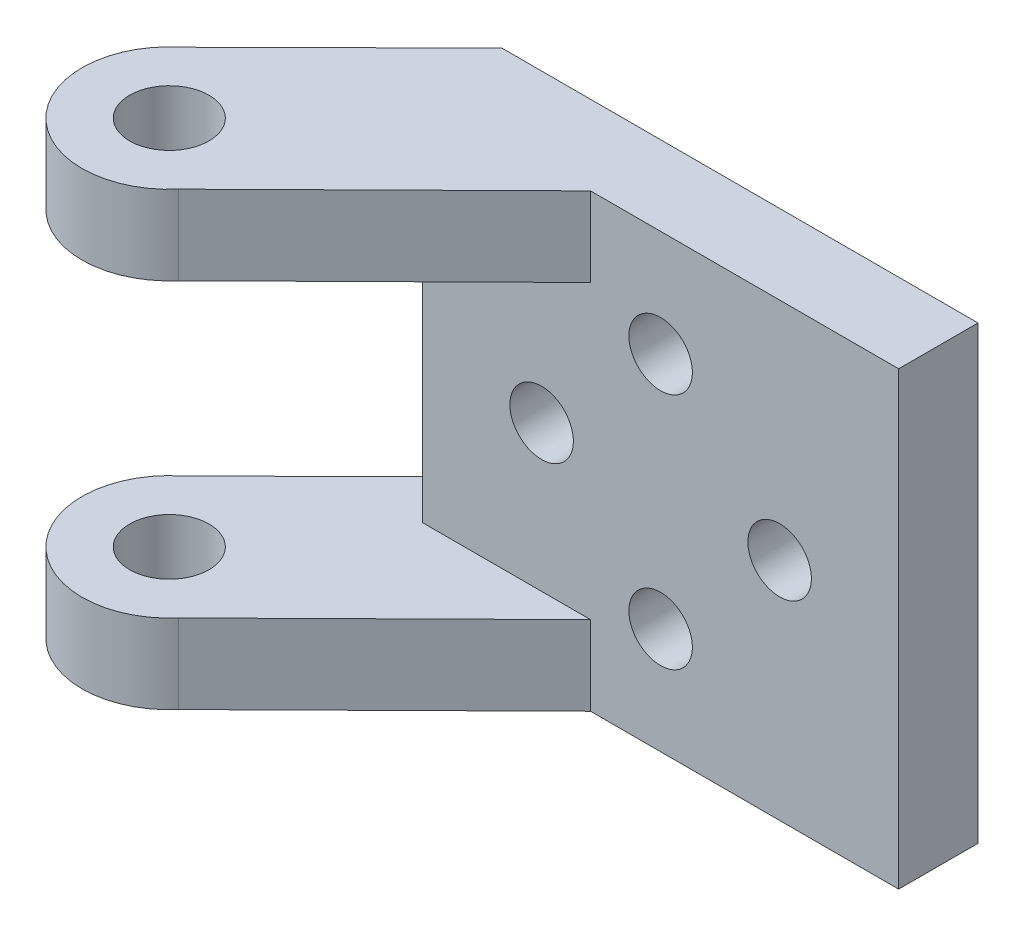
ISO-10303-21;
HEADER;
FILE_DESCRIPTION(('STEP AP214'),'2;1');
FILE_NAME('part.step','',(''),(''),'','','');
FILE_SCHEMA(('AUTOMOTIVE_DESIGN { 1 0 10303 214 1 1 1 1 }'));
ENDSEC;
DATA;
#1=APPLICATION_CONTEXT('core data for automotive mechanical design processes');
#2=APPLICATION_PROTOCOL_DEFINITION('international standard','automotive_design',2000,#1);
#3=PRODUCT_CONTEXT('',#1,'mechanical');
#4=PRODUCT('Part','Part','',(#3));
#5=PRODUCT_RELATED_PRODUCT_CATEGORY('part','',(#4));
#6=PRODUCT_DEFINITION_FORMATION('','',#4);
#7=PRODUCT_DEFINITION_CONTEXT('part definition',#1,'design');
#8=PRODUCT_DEFINITION('design','',#6,#7);
#9=PRODUCT_DEFINITION_SHAPE('','',#8);
#10=(LENGTH_UNIT() NAMED_UNIT(*) SI_UNIT(.MILLI.,.METRE.));
#11=(NAMED_UNIT(*) PLANE_ANGLE_UNIT() SI_UNIT($,.RADIAN.));
#12=(NAMED_UNIT(*) SI_UNIT($,.STERADIAN.) SOLID_ANGLE_UNIT());
#13=UNCERTAINTY_MEASURE_WITH_UNIT(LENGTH_MEASURE(1.E-05),#10,'distance_accuracy_value','');
#14=(GEOMETRIC_REPRESENTATION_CONTEXT(3) GLOBAL_UNCERTAINTY_ASSIGNED_CONTEXT((#13)) GLOBAL_UNIT_ASSIGNED_CONTEXT((#10,
#11,#12)) REPRESENTATION_CONTEXT('',''));
#15=CARTESIAN_POINT('',(0.,0.,0.));
#16=DIRECTION('',(0.,0.,1.));
#17=DIRECTION('',(1.,0.,0.));
#18=AXIS2_PLACEMENT_3D('',#15,#16,#17);
#19=CARTESIAN_POINT('',(-9.95038998939699,0.,-10.0555162784989));
#20=DIRECTION('',(-1.,0.,0.));
#21=DIRECTION('',(0.,-1.,0.));
#22=AXIS2_PLACEMENT_3D('',#19,#20,#21);
#23=PLANE('',#22);
#24=DIRECTION('',(0.,1.,0.));
#25=VECTOR('',#24,1.);
#26=CARTESIAN_POINT('',(-9.95038998939699,0.,-10.0555162784989));
#27=LINE('',#26,#25);
#28=CARTESIAN_POINT('',(-9.95038998939701,5.,-10.0555162784989));
#29=VERTEX_POINT('',#28);
#30=CARTESIAN_POINT('',(-9.950389989397,23.4,-10.0555162784989));
#31=VERTEX_POINT('',#30);
#32=EDGE_CURVE('E190',#29,#31,#27,.T.);
#33=ORIENTED_EDGE('',*,*,#32,.T.);
#34=DIRECTION('',(0.,0.,-1.));
#35=VECTOR('',#34,1.);
#36=CARTESIAN_POINT('',(-9.95038998939701,23.4,-10.0555162784989));
#37=LINE('',#36,#35);
#38=CARTESIAN_POINT('',(-9.950389989397,23.4,-15.0555162784989));
#39=VERTEX_POINT('',#38);
#40=EDGE_CURVE('E155',#31,#39,#37,.T.);
#41=ORIENTED_EDGE('',*,*,#40,.T.);
#42=DIRECTION('',(0.,1.,0.));
#43=VECTOR('',#42,1.);
#44=CARTESIAN_POINT('',(-9.95038998939699,0.,-15.0555162784989));
#45=LINE('',#44,#43);
#46=CARTESIAN_POINT('',(-9.950389989397,5.,-15.0555162784989));
#47=VERTEX_POINT('',#46);
#48=EDGE_CURVE('E212',#47,#39,#45,.T.);
#49=ORIENTED_EDGE('',*,*,#48,.F.);
#50=DIRECTION('',(0.,0.,-1.));
#51=VECTOR('',#50,1.);
#52=CARTESIAN_POINT('',(-9.950389989397,5.,-10.0555162784989));
#53=LINE('',#52,#51);
#54=EDGE_CURVE('E208',#29,#47,#53,.T.);
#55=ORIENTED_EDGE('',*,*,#54,.F.);
#56=EDGE_LOOP('',(#33,#41,#49,#55));
#57=FACE_BOUND('',#56,.T.);
#58=ADVANCED_FACE('F45',(#57),#23,.T.);
#59=CARTESIAN_POINT('',(-16.6118165220027,5.,-0.755516278498874));
#60=DIRECTION('',(0.,1.,0.));
#61=DIRECTION('',(0.,0.,1.));
#62=AXIS2_PLACEMENT_3D('',#59,#60,#61);
#63=PLANE('',#62);
#64=ORIENTED_EDGE('',*,*,#54,.T.);
#65=DIRECTION('',(-0.710498315696262,0.,0.703698901088225));
#66=VECTOR('',#65,1.);
#67=CARTESIAN_POINT('',(-9.950389989397,5.,-15.0555162784989));
#68=LINE('',#67,#66);
#69=CARTESIAN_POINT('',(-20.0724252886169,5.,-5.03034808389572));
#70=VERTEX_POINT('',#69);
#71=EDGE_CURVE('E246',#47,#70,#68,.T.);
#72=ORIENTED_EDGE('',*,*,#71,.T.);
#73=CARTESIAN_POINT('',(-16.6118165220027,5.,-0.755516278498874));
#74=DIRECTION('',(0.,1.,0.));
#75=DIRECTION('',(0.,0.,1.));
#76=AXIS2_PLACEMENT_3D('',#73,#74,#75);
#77=CIRCLE('',#76,5.5);
#78=CARTESIAN_POINT('',(-12.4365712653716,5.,2.8246131949951));
#79=VERTEX_POINT('',#78);
#80=EDGE_CURVE('E249',#70,#79,#77,.T.);
#81=ORIENTED_EDGE('',*,*,#80,.T.);
#82=DIRECTION('',(0.712249487664979,0.,-0.701926397367256));
#83=VECTOR('',#82,1.);
#84=CARTESIAN_POINT('',(-12.4365712653716,5.,2.8246131949951));
#85=LINE('',#84,#83);
#86=CARTESIAN_POINT('',(0.632983680792908,5.,-10.0555162784989));
#87=VERTEX_POINT('',#86);
#88=EDGE_CURVE('E253',#79,#87,#85,.T.);
#89=ORIENTED_EDGE('',*,*,#88,.T.);
#90=DIRECTION('',(1.,0.,0.));
#91=VECTOR('',#90,1.);
#92=CARTESIAN_POINT('',(0.,5.,-10.0555162784989));
#93=LINE('',#92,#91);
#94=EDGE_CURVE('E185',#29,#87,#93,.T.);
#95=ORIENTED_EDGE('',*,*,#94,.F.);
#96=EDGE_LOOP('',(#64,#72,#81,#89,#95));
#97=FACE_BOUND('',#96,.T.);
#98=CARTESIAN_POINT('',(-16.6118165220027,5.,-0.755516278498874));
#99=DIRECTION('',(0.,1.,0.));
#100=DIRECTION('',(0.,0.,1.));
#101=AXIS2_PLACEMENT_3D('',#98,#99,#100);
#102=CIRCLE('',#101,2.5);
#103=CARTESIAN_POINT('',(-16.6118165220027,5.,1.74448372150113));
#104=VERTEX_POINT('',#103);
#105=EDGE_CURVE('E238',#104,#104,#102,.T.);
#106=ORIENTED_EDGE('',*,*,#105,.F.);
#107=EDGE_LOOP('',(#106));
#108=FACE_BOUND('',#107,.T.);
#109=ADVANCED_FACE('F314',(#97,#108),#63,.T.);
#110=CARTESIAN_POINT('',(-16.6118165220027,0.,-0.755516278498874));
#111=DIRECTION('',(0.,1.,0.));
#112=DIRECTION('',(0.,0.,1.));
#113=AXIS2_PLACEMENT_3D('',#110,#111,#112);
#114=PLANE('',#113);
#115=DIRECTION('',(0.,0.,-1.));
#116=VECTOR('',#115,1.);
#117=CARTESIAN_POINT('',(20.049610010603,0.,-10.0555162784989));
#118=LINE('',#117,#116);
#119=CARTESIAN_POINT('',(20.049610010603,0.,-10.0555162784989));
#120=VERTEX_POINT('',#119);
#121=CARTESIAN_POINT('',(20.049610010603,0.,-15.0555162784989));
#122=VERTEX_POINT('',#121);
#123=EDGE_CURVE('E242',#120,#122,#118,.T.);
#124=ORIENTED_EDGE('',*,*,#123,.F.);
#125=DIRECTION('',(1.,0.,0.));
#126=VECTOR('',#125,1.);
#127=CARTESIAN_POINT('',(0.632983680792908,0.,-10.0555162784989));
#128=LINE('',#127,#126);
#129=CARTESIAN_POINT('',(0.632983680792908,0.,-10.0555162784989));
#130=VERTEX_POINT('',#129);
#131=EDGE_CURVE('E250',#130,#120,#128,.T.);
#132=ORIENTED_EDGE('',*,*,#131,.F.);
#133=DIRECTION('',(0.712249487664979,0.,-0.701926397367256));
#134=VECTOR('',#133,1.);
#135=CARTESIAN_POINT('',(-12.4365712653716,0.,2.8246131949951));
#136=LINE('',#135,#134);
#137=CARTESIAN_POINT('',(-12.4365712653716,0.,2.8246131949951));
#138=VERTEX_POINT('',#137);
#139=EDGE_CURVE('E269',#138,#130,#136,.T.);
#140=ORIENTED_EDGE('',*,*,#139,.F.);
#141=CARTESIAN_POINT('',(-16.6118165220027,0.,-0.755516278498874));
#142=DIRECTION('',(0.,1.,0.));
#143=DIRECTION('',(0.,0.,1.));
#144=AXIS2_PLACEMENT_3D('',#141,#142,#143);
#145=CIRCLE('',#144,5.5);
#146=CARTESIAN_POINT('',(-20.0724252886169,0.,-5.03034808389572));
#147=VERTEX_POINT('',#146);
#148=EDGE_CURVE('E266',#147,#138,#145,.T.);
#149=ORIENTED_EDGE('',*,*,#148,.F.);
#150=DIRECTION('',(-0.710498315696262,0.,0.703698901088225));
#151=VECTOR('',#150,1.);
#152=CARTESIAN_POINT('',(-9.950389989397,0.,-15.0555162784989));
#153=LINE('',#152,#151);
#154=CARTESIAN_POINT('',(-9.950389989397,0.,-15.0555162784989));
#155=VERTEX_POINT('',#154);
#156=EDGE_CURVE('E263',#155,#147,#153,.T.);
#157=ORIENTED_EDGE('',*,*,#156,.F.);
#158=DIRECTION('',(-1.,0.,0.));
#159=VECTOR('',#158,1.);
#160=CARTESIAN_POINT('',(20.049610010603,0.,-15.0555162784989));
#161=LINE('',#160,#159);
#162=EDGE_CURVE('E260',#122,#155,#161,.T.);
#163=ORIENTED_EDGE('',*,*,#162,.F.);
#164=EDGE_LOOP('',(#124,#132,#140,#149,#157,#163));
#165=FACE_BOUND('',#164,.T.);
#166=CARTESIAN_POINT('',(-16.6118165220027,0.,-0.755516278498874));
#167=DIRECTION('',(0.,1.,0.));
#168=DIRECTION('',(0.,0.,1.));
#169=AXIS2_PLACEMENT_3D('',#166,#167,#168);
#170=CIRCLE('',#169,2.5);
#171=CARTESIAN_POINT('',(-16.6118165220027,0.,1.74448372150113));
#172=VERTEX_POINT('',#171);
#173=EDGE_CURVE('E235',#172,#172,#170,.T.);
#174=ORIENTED_EDGE('',*,*,#173,.T.);
#175=EDGE_LOOP('',(#174));
#176=FACE_BOUND('',#175,.T.);
#177=ADVANCED_FACE('F301',(#165,#176),#114,.F.);
#178=CARTESIAN_POINT('',(20.049610010603,5.,-10.0555162784989));
#179=DIRECTION('',(-1.,0.,0.));
#180=DIRECTION('',(0.,0.,1.));
#181=AXIS2_PLACEMENT_3D('',#178,#179,#180);
#182=PLANE('',#181);
#183=ORIENTED_EDGE('',*,*,#123,.T.);
#184=DIRECTION('',(0.,-1.,0.));
#185=VECTOR('',#184,1.);
#186=CARTESIAN_POINT('',(20.049610010603,5.,-15.0555162784989));
#187=LINE('',#186,#185);
#188=CARTESIAN_POINT('',(20.049610010603,28.4,-15.0555162784989));
#189=VERTEX_POINT('',#188);
#190=EDGE_CURVE('E11',#189,#122,#187,.T.);
#191=ORIENTED_EDGE('',*,*,#190,.F.);
#192=DIRECTION('',(0.,0.,-1.));
#193=VECTOR('',#192,1.);
#194=CARTESIAN_POINT('',(20.049610010603,28.4,-10.0555162784989));
#195=LINE('',#194,#193);
#196=CARTESIAN_POINT('',(20.049610010603,28.4,-10.0555162784989));
#197=VERTEX_POINT('',#196);
#198=EDGE_CURVE('E231',#197,#189,#195,.T.);
#199=ORIENTED_EDGE('',*,*,#198,.F.);
#200=DIRECTION('',(0.,-1.,0.));
#201=VECTOR('',#200,1.);
#202=CARTESIAN_POINT('',(20.049610010603,5.,-10.0555162784989));
#203=LINE('',#202,#201);
#204=EDGE_CURVE('E256',#197,#120,#203,.T.);
#205=ORIENTED_EDGE('',*,*,#204,.T.);
#206=EDGE_LOOP('',(#183,#191,#199,#205));
#207=FACE_BOUND('',#206,.T.);
#208=ADVANCED_FACE('F47',(#207),#182,.F.);
#209=CARTESIAN_POINT('',(20.049610010603,5.,-15.0555162784989));
#210=DIRECTION('',(0.,0.,1.));
#211=DIRECTION('',(1.,0.,0.));
#212=AXIS2_PLACEMENT_3D('',#209,#210,#211);
#213=PLANE('',#212);
#214=CARTESIAN_POINT('',(5.04961001060293,6.7,-15.0555162784989));
#215=DIRECTION('',(0.,0.,-1.));
#216=DIRECTION('',(-1.,0.,0.));
#217=AXIS2_PLACEMENT_3D('',#214,#215,#216);
#218=CIRCLE('',#217,2.00000000000001);
#219=CARTESIAN_POINT('',(3.04961001060292,6.7,-15.0555162784989));
#220=VERTEX_POINT('',#219);
#221=EDGE_CURVE('E176',#220,#220,#218,.T.);
#222=ORIENTED_EDGE('',*,*,#221,.F.);
#223=EDGE_LOOP('',(#222));
#224=FACE_BOUND('',#223,.T.);
#225=ORIENTED_EDGE('',*,*,#162,.T.);
#226=DIRECTION('',(0.,-1.,0.));
#227=VECTOR('',#226,1.);
#228=CARTESIAN_POINT('',(-9.950389989397,5.,-15.0555162784989));
#229=LINE('',#228,#227);
#230=EDGE_CURVE('E54',#47,#155,#229,.T.);
#231=ORIENTED_EDGE('',*,*,#230,.F.);
#232=ORIENTED_EDGE('',*,*,#48,.T.);
#233=DIRECTION('',(0.,1.,0.));
#234=VECTOR('',#233,1.);
#235=CARTESIAN_POINT('',(-9.95038998939701,23.4,-15.0555162784989));
#236=LINE('',#235,#234);
#237=CARTESIAN_POINT('',(-9.95038998939701,28.4,-15.0555162784989));
#238=VERTEX_POINT('',#237);
#239=EDGE_CURVE('E140',#39,#238,#236,.T.);
#240=ORIENTED_EDGE('',*,*,#239,.T.);
#241=DIRECTION('',(1.,0.,0.));
#242=VECTOR('',#241,1.);
#243=CARTESIAN_POINT('',(0.,28.4,-15.0555162784989));
#244=LINE('',#243,#242);
#245=EDGE_CURVE('E216',#238,#189,#244,.T.);
#246=ORIENTED_EDGE('',*,*,#245,.T.);
#247=ORIENTED_EDGE('',*,*,#190,.T.);
#248=EDGE_LOOP('',(#225,#231,#232,#240,#246,#247));
#249=FACE_BOUND('',#248,.T.);
#250=CARTESIAN_POINT('',(5.04961001060303,21.7,-15.0555162784989));
#251=DIRECTION('',(0.,0.,-1.));
#252=DIRECTION('',(-1.,0.,0.));
#253=AXIS2_PLACEMENT_3D('',#250,#251,#252);
#254=CIRCLE('',#253,2.);
#255=CARTESIAN_POINT('',(3.04961001060303,21.7,-15.0555162784989));
#256=VERTEX_POINT('',#255);
#257=EDGE_CURVE('E220',#256,#256,#254,.T.);
#258=ORIENTED_EDGE('',*,*,#257,.F.);
#259=EDGE_LOOP('',(#258));
#260=FACE_BOUND('',#259,.T.);
#261=CARTESIAN_POINT('',(12.549610010603,14.1999999999999,-15.0555162784989));
#262=DIRECTION('',(0.,0.,-1.));
#263=DIRECTION('',(-1.,0.,0.));
#264=AXIS2_PLACEMENT_3D('',#261,#262,#263);
#265=CIRCLE('',#264,2.00000000000001);
#266=CARTESIAN_POINT('',(10.549610010603,14.1999999999999,-15.0555162784989));
#267=VERTEX_POINT('',#266);
#268=EDGE_CURVE('E224',#267,#267,#265,.T.);
#269=ORIENTED_EDGE('',*,*,#268,.F.);
#270=EDGE_LOOP('',(#269));
#271=FACE_BOUND('',#270,.T.);
#272=CARTESIAN_POINT('',(-2.450389989397,14.2,-15.0555162784989));
#273=DIRECTION('',(0.,0.,-1.));
#274=DIRECTION('',(-1.,0.,0.));
#275=AXIS2_PLACEMENT_3D('',#272,#273,#274);
#276=CIRCLE('',#275,2.);
#277=CARTESIAN_POINT('',(-4.450389989397,14.2,-15.0555162784989));
#278=VERTEX_POINT('',#277);
#279=EDGE_CURVE('E186',#278,#278,#276,.T.);
#280=ORIENTED_EDGE('',*,*,#279,.F.);
#281=EDGE_LOOP('',(#280));
#282=FACE_BOUND('',#281,.T.);
#283=ADVANCED_FACE('F374',(#224,#249,#260,#271,#282),#213,.F.);
#284=CARTESIAN_POINT('',(-9.950389989397,5.,-15.0555162784989));
#285=DIRECTION('',(0.703698901088225,0.,0.710498315696262));
#286=DIRECTION('',(0.710498315696262,0.,-0.703698901088225));
#287=AXIS2_PLACEMENT_3D('',#284,#285,#286);
#288=PLANE('',#287);
#289=ORIENTED_EDGE('',*,*,#156,.T.);
#290=DIRECTION('',(0.,-1.,0.));
#291=VECTOR('',#290,1.);
#292=CARTESIAN_POINT('',(-20.0724252886169,5.,-5.03034808389572));
#293=LINE('',#292,#291);
#294=EDGE_CURVE('E285',#70,#147,#293,.T.);
#295=ORIENTED_EDGE('',*,*,#294,.F.);
#296=ORIENTED_EDGE('',*,*,#71,.F.);
#297=ORIENTED_EDGE('',*,*,#230,.T.);
#298=EDGE_LOOP('',(#289,#295,#296,#297));
#299=FACE_BOUND('',#298,.T.);
#300=ADVANCED_FACE('F294',(#299),#288,.F.);
#301=CARTESIAN_POINT('',(-16.6118165220027,5.,-0.755516278498874));
#302=DIRECTION('',(0.,-1.,0.));
#303=DIRECTION('',(0.,0.,-1.));
#304=AXIS2_PLACEMENT_3D('',#301,#302,#303);
#305=CYLINDRICAL_SURFACE('',#304,5.5);
#306=ORIENTED_EDGE('',*,*,#148,.T.);
#307=DIRECTION('',(0.,-1.,0.));
#308=VECTOR('',#307,1.);
#309=CARTESIAN_POINT('',(-12.4365712653716,5.,2.8246131949951));
#310=LINE('',#309,#308);
#311=EDGE_CURVE('E281',#79,#138,#310,.T.);
#312=ORIENTED_EDGE('',*,*,#311,.F.);
#313=ORIENTED_EDGE('',*,*,#80,.F.);
#314=ORIENTED_EDGE('',*,*,#294,.T.);
#315=EDGE_LOOP('',(#306,#312,#313,#314));
#316=FACE_BOUND('',#315,.T.);
#317=ADVANCED_FACE('F307',(#316),#305,.T.);
#318=CARTESIAN_POINT('',(-12.4365712653716,5.,2.8246131949951));
#319=DIRECTION('',(-0.701926397367256,0.,-0.712249487664979));
#320=DIRECTION('',(-0.712249487664979,0.,0.701926397367256));
#321=AXIS2_PLACEMENT_3D('',#318,#319,#320);
#322=PLANE('',#321);
#323=ORIENTED_EDGE('',*,*,#139,.T.);
#324=DIRECTION('',(0.,-1.,0.));
#325=VECTOR('',#324,1.);
#326=CARTESIAN_POINT('',(0.632983680792908,5.,-10.0555162784989));
#327=LINE('',#326,#325);
#328=EDGE_CURVE('E277',#87,#130,#327,.T.);
#329=ORIENTED_EDGE('',*,*,#328,.F.);
#330=ORIENTED_EDGE('',*,*,#88,.F.);
#331=ORIENTED_EDGE('',*,*,#311,.T.);
#332=EDGE_LOOP('',(#323,#329,#330,#331));
#333=FACE_BOUND('',#332,.T.);
#334=ADVANCED_FACE('F311',(#333),#322,.F.);
#335=CARTESIAN_POINT('',(0.632983680792908,5.,-10.0555162784989));
#336=DIRECTION('',(0.,0.,-1.));
#337=DIRECTION('',(-1.,0.,0.));
#338=AXIS2_PLACEMENT_3D('',#335,#336,#337);
#339=PLANE('',#338);
#340=DIRECTION('',(1.,0.,0.));
#341=VECTOR('',#340,1.);
#342=CARTESIAN_POINT('',(0.,28.4,-10.0555162784989));
#343=LINE('',#342,#341);
#344=CARTESIAN_POINT('',(0.632983680792904,28.4,-10.0555162784989));
#345=VERTEX_POINT('',#344);
#346=EDGE_CURVE('E66',#345,#197,#343,.T.);
#347=ORIENTED_EDGE('',*,*,#346,.F.);
#348=DIRECTION('',(0.,1.,0.));
#349=VECTOR('',#348,1.);
#350=CARTESIAN_POINT('',(0.632983680792904,23.4,-10.0555162784989));
#351=LINE('',#350,#349);
#352=CARTESIAN_POINT('',(0.632983680792904,23.4,-10.0555162784989));
#353=VERTEX_POINT('',#352);
#354=EDGE_CURVE('E61',#353,#345,#351,.T.);
#355=ORIENTED_EDGE('',*,*,#354,.F.);
#356=DIRECTION('',(-1.,0.,0.));
#357=VECTOR('',#356,1.);
#358=CARTESIAN_POINT('',(0.632983680792904,23.4,-10.0555162784989));
#359=LINE('',#358,#357);
#360=EDGE_CURVE('E158',#353,#31,#359,.T.);
#361=ORIENTED_EDGE('',*,*,#360,.T.);
#362=ORIENTED_EDGE('',*,*,#32,.F.);
#363=ORIENTED_EDGE('',*,*,#94,.T.);
#364=ORIENTED_EDGE('',*,*,#328,.T.);
#365=ORIENTED_EDGE('',*,*,#131,.T.);
#366=ORIENTED_EDGE('',*,*,#204,.F.);
#367=EDGE_LOOP('',(#347,#355,#361,#362,#363,#364,#365,#366));
#368=FACE_BOUND('',#367,.T.);
#369=CARTESIAN_POINT('',(5.04961001060293,6.7,-10.0555162784989));
#370=DIRECTION('',(0.,0.,-1.));
#371=DIRECTION('',(-1.,0.,0.));
#372=AXIS2_PLACEMENT_3D('',#369,#370,#371);
#373=CIRCLE('',#372,2.00000000000001);
#374=CARTESIAN_POINT('',(3.04961001060292,6.7,-10.0555162784989));
#375=VERTEX_POINT('',#374);
#376=EDGE_CURVE('E181',#375,#375,#373,.T.);
#377=ORIENTED_EDGE('',*,*,#376,.T.);
#378=EDGE_LOOP('',(#377));
#379=FACE_BOUND('',#378,.T.);
#380=CARTESIAN_POINT('',(5.04961001060303,21.7,-10.0555162784989));
#381=DIRECTION('',(0.,0.,-1.));
#382=DIRECTION('',(-1.,0.,0.));
#383=AXIS2_PLACEMENT_3D('',#380,#381,#382);
#384=CIRCLE('',#383,2.);
#385=CARTESIAN_POINT('',(3.04961001060303,21.7,-10.0555162784989));
#386=VERTEX_POINT('',#385);
#387=EDGE_CURVE('E196',#386,#386,#384,.T.);
#388=ORIENTED_EDGE('',*,*,#387,.T.);
#389=EDGE_LOOP('',(#388));
#390=FACE_BOUND('',#389,.T.);
#391=CARTESIAN_POINT('',(12.549610010603,14.1999999999999,-10.0555162784989));
#392=DIRECTION('',(0.,0.,-1.));
#393=DIRECTION('',(-1.,0.,0.));
#394=AXIS2_PLACEMENT_3D('',#391,#392,#393);
#395=CIRCLE('',#394,2.00000000000001);
#396=CARTESIAN_POINT('',(10.549610010603,14.1999999999999,-10.0555162784989));
#397=VERTEX_POINT('',#396);
#398=EDGE_CURVE('E200',#397,#397,#395,.T.);
#399=ORIENTED_EDGE('',*,*,#398,.T.);
#400=EDGE_LOOP('',(#399));
#401=FACE_BOUND('',#400,.T.);
#402=CARTESIAN_POINT('',(-2.450389989397,14.2,-10.0555162784989));
#403=DIRECTION('',(0.,0.,-1.));
#404=DIRECTION('',(-1.,0.,0.));
#405=AXIS2_PLACEMENT_3D('',#402,#403,#404);
#406=CIRCLE('',#405,2.);
#407=CARTESIAN_POINT('',(-4.450389989397,14.2,-10.0555162784989));
#408=VERTEX_POINT('',#407);
#409=EDGE_CURVE('E204',#408,#408,#406,.T.);
#410=ORIENTED_EDGE('',*,*,#409,.T.);
#411=EDGE_LOOP('',(#410));
#412=FACE_BOUND('',#411,.T.);
#413=ADVANCED_FACE('F319',(#368,#379,#390,#401,#412),#339,.F.);
#414=CARTESIAN_POINT('',(-16.6118165220027,5.,-0.755516278498874));
#415=DIRECTION('',(0.,-1.,0.));
#416=DIRECTION('',(0.,0.,-1.));
#417=AXIS2_PLACEMENT_3D('',#414,#415,#416);
#418=CYLINDRICAL_SURFACE('',#417,2.5);
#419=ORIENTED_EDGE('',*,*,#105,.T.);
#420=EDGE_LOOP('',(#419));
#421=FACE_BOUND('',#420,.T.);
#422=ORIENTED_EDGE('',*,*,#173,.F.);
#423=EDGE_LOOP('',(#422));
#424=FACE_BOUND('',#423,.T.);
#425=ADVANCED_FACE('F351',(#421,#424),#418,.F.);
#426=CARTESIAN_POINT('',(5.04961001060293,6.7,-10.0555162784989));
#427=DIRECTION('',(0.,0.,-1.));
#428=DIRECTION('',(-1.,0.,0.));
#429=AXIS2_PLACEMENT_3D('',#426,#427,#428);
#430=CYLINDRICAL_SURFACE('',#429,2.00000000000001);
#431=ORIENTED_EDGE('',*,*,#221,.T.);
#432=EDGE_LOOP('',(#431));
#433=FACE_BOUND('',#432,.T.);
#434=ORIENTED_EDGE('',*,*,#376,.F.);
#435=EDGE_LOOP('',(#434));
#436=FACE_BOUND('',#435,.T.);
#437=ADVANCED_FACE('F341',(#433,#436),#430,.F.);
#438=CARTESIAN_POINT('',(0.,28.4,-10.0555162784989));
#439=DIRECTION('',(0.,1.,0.));
#440=DIRECTION('',(-1.,0.,0.));
#441=AXIS2_PLACEMENT_3D('',#438,#439,#440);
#442=PLANE('',#441);
#443=DIRECTION('',(0.712249487664979,0.,-0.701926397367256));
#444=VECTOR('',#443,1.);
#445=CARTESIAN_POINT('',(-12.4365712653716,28.4,2.8246131949951));
#446=LINE('',#445,#444);
#447=CARTESIAN_POINT('',(-12.4365712653716,28.4,2.8246131949951));
#448=VERTEX_POINT('',#447);
#449=EDGE_CURVE('E170',#448,#345,#446,.T.);
#450=ORIENTED_EDGE('',*,*,#449,.T.);
#451=ORIENTED_EDGE('',*,*,#346,.T.);
#452=ORIENTED_EDGE('',*,*,#198,.T.);
#453=ORIENTED_EDGE('',*,*,#245,.F.);
#454=DIRECTION('',(-0.710498315696262,0.,0.703698901088225));
#455=VECTOR('',#454,1.);
#456=CARTESIAN_POINT('',(-9.95038998939701,28.4,-15.0555162784989));
#457=LINE('',#456,#455);
#458=CARTESIAN_POINT('',(-20.0724252886169,28.4,-5.03034808389572));
#459=VERTEX_POINT('',#458);
#460=EDGE_CURVE('E164',#238,#459,#457,.T.);
#461=ORIENTED_EDGE('',*,*,#460,.T.);
#462=CARTESIAN_POINT('',(-16.6118165220027,28.4,-0.755516278498874));
#463=DIRECTION('',(0.,1.,0.));
#464=DIRECTION('',(-1.,0.,0.));
#465=AXIS2_PLACEMENT_3D('',#462,#463,#464);
#466=CIRCLE('',#465,5.5);
#467=EDGE_CURVE('E133',#459,#448,#466,.T.);
#468=ORIENTED_EDGE('',*,*,#467,.T.);
#469=EDGE_LOOP('',(#450,#451,#452,#453,#461,#468));
#470=FACE_BOUND('',#469,.T.);
#471=CARTESIAN_POINT('',(-16.6118165220027,28.4,-0.755516278498874));
#472=DIRECTION('',(0.,1.,0.));
#473=DIRECTION('',(-1.,0.,0.));
#474=AXIS2_PLACEMENT_3D('',#471,#472,#473);
#475=CIRCLE('',#474,2.5);
#476=CARTESIAN_POINT('',(-19.1118165220027,28.4,-0.755516278498874));
#477=VERTEX_POINT('',#476);
#478=EDGE_CURVE('E323',#477,#477,#475,.T.);
#479=ORIENTED_EDGE('',*,*,#478,.F.);
#480=EDGE_LOOP('',(#479));
#481=FACE_BOUND('',#480,.T.);
#482=ADVANCED_FACE('F338',(#470,#481),#442,.T.);
#483=CARTESIAN_POINT('',(12.549610010603,14.1999999999999,-10.0555162784989));
#484=DIRECTION('',(0.,0.,-1.));
#485=DIRECTION('',(-1.,0.,0.));
#486=AXIS2_PLACEMENT_3D('',#483,#484,#485);
#487=CYLINDRICAL_SURFACE('',#486,2.00000000000001);
#488=ORIENTED_EDGE('',*,*,#398,.F.);
#489=EDGE_LOOP('',(#488));
#490=FACE_BOUND('',#489,.T.);
#491=ORIENTED_EDGE('',*,*,#268,.T.);
#492=EDGE_LOOP('',(#491));
#493=FACE_BOUND('',#492,.T.);
#494=ADVANCED_FACE('F340',(#490,#493),#487,.F.);
#495=CARTESIAN_POINT('',(5.04961001060303,21.7,-10.0555162784989));
#496=DIRECTION('',(0.,0.,-1.));
#497=DIRECTION('',(-1.,0.,0.));
#498=AXIS2_PLACEMENT_3D('',#495,#496,#497);
#499=CYLINDRICAL_SURFACE('',#498,2.);
#500=ORIENTED_EDGE('',*,*,#387,.F.);
#501=EDGE_LOOP('',(#500));
#502=FACE_BOUND('',#501,.T.);
#503=ORIENTED_EDGE('',*,*,#257,.T.);
#504=EDGE_LOOP('',(#503));
#505=FACE_BOUND('',#504,.T.);
#506=ADVANCED_FACE('F348',(#502,#505),#499,.F.);
#507=CARTESIAN_POINT('',(-2.450389989397,14.2,-10.0555162784989));
#508=DIRECTION('',(0.,0.,-1.));
#509=DIRECTION('',(-1.,0.,0.));
#510=AXIS2_PLACEMENT_3D('',#507,#508,#509);
#511=CYLINDRICAL_SURFACE('',#510,2.);
#512=ORIENTED_EDGE('',*,*,#409,.F.);
#513=EDGE_LOOP('',(#512));
#514=FACE_BOUND('',#513,.T.);
#515=ORIENTED_EDGE('',*,*,#279,.T.);
#516=EDGE_LOOP('',(#515));
#517=FACE_BOUND('',#516,.T.);
#518=ADVANCED_FACE('F389',(#514,#517),#511,.F.);
#519=CARTESIAN_POINT('',(-12.4365712653716,23.4,2.8246131949951));
#520=DIRECTION('',(0.701926397367256,0.,0.712249487664979));
#521=DIRECTION('',(0.712249487664979,0.,-0.701926397367256));
#522=AXIS2_PLACEMENT_3D('',#519,#520,#521);
#523=PLANE('',#522);
#524=ORIENTED_EDGE('',*,*,#449,.F.);
#525=DIRECTION('',(0.,1.,0.));
#526=VECTOR('',#525,1.);
#527=CARTESIAN_POINT('',(-12.4365712653716,23.4,2.8246131949951));
#528=LINE('',#527,#526);
#529=CARTESIAN_POINT('',(-12.4365712653716,23.4,2.8246131949951));
#530=VERTEX_POINT('',#529);
#531=EDGE_CURVE('E139',#530,#448,#528,.T.);
#532=ORIENTED_EDGE('',*,*,#531,.F.);
#533=DIRECTION('',(0.712249487664979,0.,-0.701926397367256));
#534=VECTOR('',#533,1.);
#535=CARTESIAN_POINT('',(-12.4365712653716,23.4,2.8246131949951));
#536=LINE('',#535,#534);
#537=EDGE_CURVE('E148',#530,#353,#536,.T.);
#538=ORIENTED_EDGE('',*,*,#537,.T.);
#539=ORIENTED_EDGE('',*,*,#354,.T.);
#540=EDGE_LOOP('',(#524,#532,#538,#539));
#541=FACE_BOUND('',#540,.T.);
#542=ADVANCED_FACE('F391',(#541),#523,.T.);
#543=CARTESIAN_POINT('',(-16.6118165220027,23.4,-0.755516278498874));
#544=DIRECTION('',(0.,1.,0.));
#545=DIRECTION('',(-1.,0.,0.));
#546=AXIS2_PLACEMENT_3D('',#543,#544,#545);
#547=CYLINDRICAL_SURFACE('',#546,5.5);
#548=ORIENTED_EDGE('',*,*,#467,.F.);
#549=DIRECTION('',(0.,1.,0.));
#550=VECTOR('',#549,1.);
#551=CARTESIAN_POINT('',(-20.0724252886169,23.4,-5.03034808389572));
#552=LINE('',#551,#550);
#553=CARTESIAN_POINT('',(-20.0724252886169,23.4,-5.03034808389572));
#554=VERTEX_POINT('',#553);
#555=EDGE_CURVE('E127',#554,#459,#552,.T.);
#556=ORIENTED_EDGE('',*,*,#555,.F.);
#557=CARTESIAN_POINT('',(-16.6118165220027,23.4,-0.755516278498874));
#558=DIRECTION('',(0.,1.,0.));
#559=DIRECTION('',(-1.,0.,0.));
#560=AXIS2_PLACEMENT_3D('',#557,#558,#559);
#561=CIRCLE('',#560,5.5);
#562=EDGE_CURVE('E130',#554,#530,#561,.T.);
#563=ORIENTED_EDGE('',*,*,#562,.T.);
#564=ORIENTED_EDGE('',*,*,#531,.T.);
#565=EDGE_LOOP('',(#548,#556,#563,#564));
#566=FACE_BOUND('',#565,.T.);
#567=ADVANCED_FACE('F129',(#566),#547,.T.);
#568=CARTESIAN_POINT('',(-9.95038998939701,23.4,-15.0555162784989));
#569=DIRECTION('',(-0.703698901088225,0.,-0.710498315696262));
#570=DIRECTION('',(-0.710498315696262,0.,0.703698901088225));
#571=AXIS2_PLACEMENT_3D('',#568,#569,#570);
#572=PLANE('',#571);
#573=ORIENTED_EDGE('',*,*,#460,.F.);
#574=ORIENTED_EDGE('',*,*,#239,.F.);
#575=DIRECTION('',(-0.710498315696262,0.,0.703698901088225));
#576=VECTOR('',#575,1.);
#577=CARTESIAN_POINT('',(-9.95038998939701,23.4,-15.0555162784989));
#578=LINE('',#577,#576);
#579=EDGE_CURVE('E146',#39,#554,#578,.T.);
#580=ORIENTED_EDGE('',*,*,#579,.T.);
#581=ORIENTED_EDGE('',*,*,#555,.T.);
#582=EDGE_LOOP('',(#573,#574,#580,#581));
#583=FACE_BOUND('',#582,.T.);
#584=ADVANCED_FACE('F152',(#583),#572,.T.);
#585=CARTESIAN_POINT('',(-16.6118165220027,23.4,-0.755516278498874));
#586=DIRECTION('',(0.,1.,0.));
#587=DIRECTION('',(-1.,0.,0.));
#588=AXIS2_PLACEMENT_3D('',#585,#586,#587);
#589=PLANE('',#588);
#590=CARTESIAN_POINT('',(-16.6118165220027,23.4,-0.755516278498874));
#591=DIRECTION('',(0.,1.,0.));
#592=DIRECTION('',(-1.,0.,0.));
#593=AXIS2_PLACEMENT_3D('',#590,#591,#592);
#594=CIRCLE('',#593,2.5);
#595=CARTESIAN_POINT('',(-19.1118165220027,23.4,-0.755516278498874));
#596=VERTEX_POINT('',#595);
#597=EDGE_CURVE('E167',#596,#596,#594,.T.);
#598=ORIENTED_EDGE('',*,*,#597,.T.);
#599=EDGE_LOOP('',(#598));
#600=FACE_BOUND('',#599,.T.);
#601=ORIENTED_EDGE('',*,*,#360,.F.);
#602=ORIENTED_EDGE('',*,*,#537,.F.);
#603=ORIENTED_EDGE('',*,*,#562,.F.);
#604=ORIENTED_EDGE('',*,*,#579,.F.);
#605=ORIENTED_EDGE('',*,*,#40,.F.);
#606=EDGE_LOOP('',(#601,#602,#603,#604,#605));
#607=FACE_BOUND('',#606,.T.);
#608=ADVANCED_FACE('F144',(#600,#607),#589,.F.);
#609=CARTESIAN_POINT('',(-16.6118165220027,23.4,-0.755516278498874));
#610=DIRECTION('',(0.,1.,0.));
#611=DIRECTION('',(-1.,0.,0.));
#612=AXIS2_PLACEMENT_3D('',#609,#610,#611);
#613=CYLINDRICAL_SURFACE('',#612,2.5);
#614=ORIENTED_EDGE('',*,*,#597,.F.);
#615=EDGE_LOOP('',(#614));
#616=FACE_BOUND('',#615,.T.);
#617=ORIENTED_EDGE('',*,*,#478,.T.);
#618=EDGE_LOOP('',(#617));
#619=FACE_BOUND('',#618,.T.);
#620=ADVANCED_FACE('F332',(#616,#619),#613,.F.);
#621=CLOSED_SHELL('',(#58,#109,#177,#208,#283,#300,#317,#334,#413,#425,#437,#482,#494,#506,#518,
#542,#567,#584,#608,#620));
#622=MANIFOLD_SOLID_BREP('B2',#621);
#623=ADVANCED_BREP_SHAPE_REPRESENTATION('',(#18,#622),#14);
#624=SHAPE_DEFINITION_REPRESENTATION(#9,#623);
ENDSEC;
END-ISO-10303-21;
